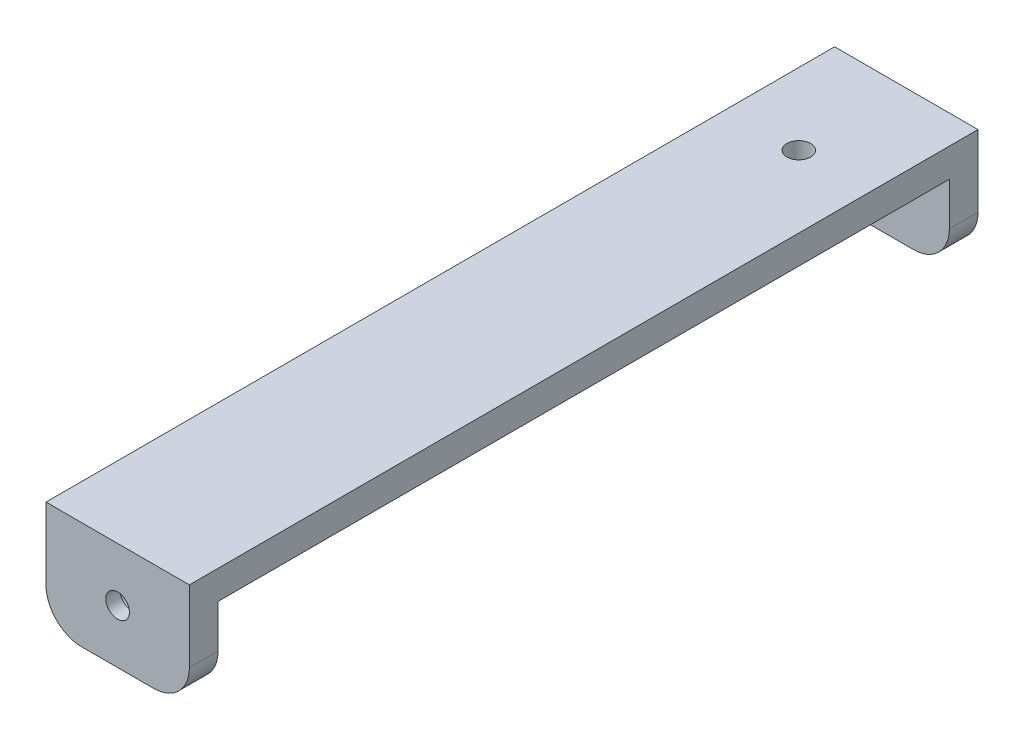
ISO-10303-21;
HEADER;
FILE_DESCRIPTION(('STEP AP214'),'2;1');
FILE_NAME('part.step','',(''),(''),'','','');
FILE_SCHEMA(('AUTOMOTIVE_DESIGN { 1 0 10303 214 1 1 1 1 }'));
ENDSEC;
DATA;
#1=APPLICATION_CONTEXT('core data for automotive mechanical design processes');
#2=APPLICATION_PROTOCOL_DEFINITION('international standard','automotive_design',2000,#1);
#3=PRODUCT_CONTEXT('',#1,'mechanical');
#4=PRODUCT('Part','Part','',(#3));
#5=PRODUCT_RELATED_PRODUCT_CATEGORY('part','',(#4));
#6=PRODUCT_DEFINITION_FORMATION('','',#4);
#7=PRODUCT_DEFINITION_CONTEXT('part definition',#1,'design');
#8=PRODUCT_DEFINITION('design','',#6,#7);
#9=PRODUCT_DEFINITION_SHAPE('','',#8);
#10=(LENGTH_UNIT() NAMED_UNIT(*) SI_UNIT(.MILLI.,.METRE.));
#11=(NAMED_UNIT(*) PLANE_ANGLE_UNIT() SI_UNIT($,.RADIAN.));
#12=(NAMED_UNIT(*) SI_UNIT($,.STERADIAN.) SOLID_ANGLE_UNIT());
#13=UNCERTAINTY_MEASURE_WITH_UNIT(LENGTH_MEASURE(1.E-05),#10,'distance_accuracy_value','');
#14=(GEOMETRIC_REPRESENTATION_CONTEXT(3) GLOBAL_UNCERTAINTY_ASSIGNED_CONTEXT((#13)) GLOBAL_UNIT_ASSIGNED_CONTEXT((#10,
#11,#12)) REPRESENTATION_CONTEXT('',''));
#15=CARTESIAN_POINT('',(0.,0.,0.));
#16=DIRECTION('',(0.,0.,1.));
#17=DIRECTION('',(1.,0.,0.));
#18=AXIS2_PLACEMENT_3D('',#15,#16,#17);
#19=CARTESIAN_POINT('',(-0.512507822280768,122.5,381.));
#20=DIRECTION('',(0.,0.,-1.));
#21=DIRECTION('',(0.,1.,0.));
#22=AXIS2_PLACEMENT_3D('',#19,#20,#21);
#23=CYLINDRICAL_SURFACE('',#22,1.65);
#24=CARTESIAN_POINT('',(-0.512507822280768,122.5,360.));
#25=DIRECTION('',(0.,0.,-1.));
#26=DIRECTION('',(0.,1.,0.));
#27=AXIS2_PLACEMENT_3D('',#24,#25,#26);
#28=CIRCLE('',#27,1.65);
#29=CARTESIAN_POINT('',(-0.512507822280768,124.15,360.));
#30=VERTEX_POINT('',#29);
#31=EDGE_CURVE('E371',#30,#30,#28,.F.);
#32=ORIENTED_EDGE('',*,*,#31,.T.);
#33=EDGE_LOOP('',(#32));
#34=FACE_BOUND('',#33,.T.);
#35=CARTESIAN_POINT('',(-0.512507822280768,122.5,358.));
#36=DIRECTION('',(0.,0.,1.));
#37=DIRECTION('',(0.,-1.,0.));
#38=AXIS2_PLACEMENT_3D('',#35,#36,#37);
#39=CIRCLE('',#38,1.65);
#40=CARTESIAN_POINT('',(-0.512507822280768,120.85,358.));
#41=VERTEX_POINT('',#40);
#42=EDGE_CURVE('E422',#41,#41,#39,.T.);
#43=ORIENTED_EDGE('',*,*,#42,.F.);
#44=EDGE_LOOP('',(#43));
#45=FACE_BOUND('',#44,.T.);
#46=ADVANCED_FACE('F16',(#34,#45),#23,.F.);
#47=CARTESIAN_POINT('',(-0.512507822280768,122.5,249.998));
#48=DIRECTION('',(0.,0.,1.));
#49=DIRECTION('',(0.,-1.,0.));
#50=AXIS2_PLACEMENT_3D('',#47,#48,#49);
#51=CYLINDRICAL_SURFACE('',#50,1.65);
#52=CARTESIAN_POINT('',(-0.512507822280768,122.5,250.));
#53=DIRECTION('',(0.,0.,1.));
#54=DIRECTION('',(0.,-1.,0.));
#55=AXIS2_PLACEMENT_3D('',#52,#53,#54);
#56=CIRCLE('',#55,1.65);
#57=CARTESIAN_POINT('',(-0.512507822280768,120.85,250.));
#58=VERTEX_POINT('',#57);
#59=EDGE_CURVE('E265',#58,#58,#56,.F.);
#60=ORIENTED_EDGE('',*,*,#59,.T.);
#61=EDGE_LOOP('',(#60));
#62=FACE_BOUND('',#61,.T.);
#63=CARTESIAN_POINT('',(-0.512507822280768,122.5,252.));
#64=DIRECTION('',(0.,0.,1.));
#65=DIRECTION('',(1.,0.,0.));
#66=AXIS2_PLACEMENT_3D('',#63,#64,#65);
#67=CIRCLE('',#66,1.65);
#68=CARTESIAN_POINT('',(1.13749217771923,122.5,252.));
#69=VERTEX_POINT('',#68);
#70=EDGE_CURVE('E370',#69,#69,#67,.T.);
#71=ORIENTED_EDGE('',*,*,#70,.T.);
#72=EDGE_LOOP('',(#71));
#73=FACE_BOUND('',#72,.T.);
#74=ADVANCED_FACE('F343',(#62,#73),#51,.F.);
#75=CARTESIAN_POINT('',(9.5,126.,357.932813763619));
#76=DIRECTION('',(1.,0.,0.));
#77=DIRECTION('',(0.,0.,-1.));
#78=AXIS2_PLACEMENT_3D('',#75,#76,#77);
#79=PLANE('',#78);
#80=DIRECTION('',(0.,1.,0.));
#81=VECTOR('',#80,1.);
#82=CARTESIAN_POINT('',(9.5,115.,254.));
#83=LINE('',#82,#81);
#84=CARTESIAN_POINT('',(9.5,120.,254.));
#85=VERTEX_POINT('',#84);
#86=CARTESIAN_POINT('',(9.5,126.,254.));
#87=VERTEX_POINT('',#86);
#88=EDGE_CURVE('E149',#85,#87,#83,.T.);
#89=ORIENTED_EDGE('',*,*,#88,.F.);
#90=DIRECTION('',(0.,0.,1.));
#91=VECTOR('',#90,1.);
#92=CARTESIAN_POINT('',(9.5,120.,250.));
#93=LINE('',#92,#91);
#94=CARTESIAN_POINT('',(9.5,120.,250.));
#95=VERTEX_POINT('',#94);
#96=EDGE_CURVE('E239',#85,#95,#93,.F.);
#97=ORIENTED_EDGE('',*,*,#96,.T.);
#98=DIRECTION('',(0.,1.,0.));
#99=VECTOR('',#98,1.);
#100=CARTESIAN_POINT('',(9.5,126.,250.));
#101=LINE('',#100,#99);
#102=CARTESIAN_POINT('',(9.5,130.,250.));
#103=VERTEX_POINT('',#102);
#104=EDGE_CURVE('E206',#95,#103,#101,.T.);
#105=ORIENTED_EDGE('',*,*,#104,.T.);
#106=DIRECTION('',(0.,0.,-1.));
#107=VECTOR('',#106,1.);
#108=CARTESIAN_POINT('',(9.5,130.,357.932813763619));
#109=LINE('',#108,#107);
#110=CARTESIAN_POINT('',(9.50000000000015,130.,360.));
#111=VERTEX_POINT('',#110);
#112=EDGE_CURVE('E193',#111,#103,#109,.T.);
#113=ORIENTED_EDGE('',*,*,#112,.F.);
#114=DIRECTION('',(0.,1.,0.));
#115=VECTOR('',#114,1.);
#116=CARTESIAN_POINT('',(9.50000000000015,126.,360.));
#117=LINE('',#116,#115);
#118=CARTESIAN_POINT('',(9.50000000000015,120.,360.));
#119=VERTEX_POINT('',#118);
#120=EDGE_CURVE('E173',#119,#111,#117,.T.);
#121=ORIENTED_EDGE('',*,*,#120,.F.);
#122=DIRECTION('',(0.,0.,-1.));
#123=VECTOR('',#122,1.);
#124=CARTESIAN_POINT('',(9.5,120.,356.));
#125=LINE('',#124,#123);
#126=CARTESIAN_POINT('',(9.5,120.,356.));
#127=VERTEX_POINT('',#126);
#128=EDGE_CURVE('E235',#119,#127,#125,.T.);
#129=ORIENTED_EDGE('',*,*,#128,.T.);
#130=DIRECTION('',(0.,1.,0.));
#131=VECTOR('',#130,1.);
#132=CARTESIAN_POINT('',(9.5,115.,356.));
#133=LINE('',#132,#131);
#134=CARTESIAN_POINT('',(9.5,126.,356.));
#135=VERTEX_POINT('',#134);
#136=EDGE_CURVE('E186',#127,#135,#133,.T.);
#137=ORIENTED_EDGE('',*,*,#136,.T.);
#138=DIRECTION('',(0.,0.,-1.));
#139=VECTOR('',#138,1.);
#140=CARTESIAN_POINT('',(9.5,126.,357.932813763619));
#141=LINE('',#140,#139);
#142=EDGE_CURVE('E166',#135,#87,#141,.T.);
#143=ORIENTED_EDGE('',*,*,#142,.T.);
#144=EDGE_LOOP('',(#89,#97,#105,#113,#121,#129,#137,#143));
#145=FACE_BOUND('',#144,.T.);
#146=ADVANCED_FACE('F338',(#145),#79,.T.);
#147=CARTESIAN_POINT('',(1.1693695560098,126.,250.));
#148=DIRECTION('',(0.,0.,1.));
#149=DIRECTION('',(0.,-1.,0.));
#150=AXIS2_PLACEMENT_3D('',#147,#148,#149);
#151=PLANE('',#150);
#152=ORIENTED_EDGE('',*,*,#59,.F.);
#153=EDGE_LOOP('',(#152));
#154=FACE_BOUND('',#153,.T.);
#155=DIRECTION('',(1.,0.,0.));
#156=VECTOR('',#155,1.);
#157=CARTESIAN_POINT('',(1.1693695560098,115.,250.));
#158=LINE('',#157,#156);
#159=CARTESIAN_POINT('',(-5.49999999999992,115.,250.));
#160=VERTEX_POINT('',#159);
#161=CARTESIAN_POINT('',(4.50000000000008,115.,250.));
#162=VERTEX_POINT('',#161);
#163=EDGE_CURVE('E260',#160,#162,#158,.T.);
#164=ORIENTED_EDGE('',*,*,#163,.F.);
#165=CARTESIAN_POINT('',(-5.49999999999992,120.,250.));
#166=DIRECTION('',(0.,0.,1.));
#167=DIRECTION('',(0.,-1.,0.));
#168=AXIS2_PLACEMENT_3D('',#165,#166,#167);
#169=CIRCLE('',#168,5.);
#170=CARTESIAN_POINT('',(-10.5,120.,250.));
#171=VERTEX_POINT('',#170);
#172=EDGE_CURVE('E232',#160,#171,#169,.F.);
#173=ORIENTED_EDGE('',*,*,#172,.T.);
#174=DIRECTION('',(0.,1.,0.));
#175=VECTOR('',#174,1.);
#176=CARTESIAN_POINT('',(-10.5,126.,250.));
#177=LINE('',#176,#175);
#178=CARTESIAN_POINT('',(-10.5,130.,250.));
#179=VERTEX_POINT('',#178);
#180=EDGE_CURVE('E205',#171,#179,#177,.T.);
#181=ORIENTED_EDGE('',*,*,#180,.T.);
#182=DIRECTION('',(1.,0.,0.));
#183=VECTOR('',#182,1.);
#184=CARTESIAN_POINT('',(1.1693695560098,130.,250.));
#185=LINE('',#184,#183);
#186=EDGE_CURVE('E181',#179,#103,#185,.T.);
#187=ORIENTED_EDGE('',*,*,#186,.T.);
#188=ORIENTED_EDGE('',*,*,#104,.F.);
#189=CARTESIAN_POINT('',(4.50000000000008,120.,250.));
#190=DIRECTION('',(0.,0.,1.));
#191=DIRECTION('',(0.,-1.,0.));
#192=AXIS2_PLACEMENT_3D('',#189,#190,#191);
#193=CIRCLE('',#192,5.);
#194=EDGE_CURVE('E229',#95,#162,#193,.F.);
#195=ORIENTED_EDGE('',*,*,#194,.T.);
#196=EDGE_LOOP('',(#164,#173,#181,#187,#188,#195));
#197=FACE_BOUND('',#196,.T.);
#198=ADVANCED_FACE('F342',(#154,#197),#151,.F.);
#199=CARTESIAN_POINT('',(-10.5,126.,357.932813763619));
#200=DIRECTION('',(1.,0.,0.));
#201=DIRECTION('',(0.,0.,-1.));
#202=AXIS2_PLACEMENT_3D('',#199,#200,#201);
#203=PLANE('',#202);
#204=ORIENTED_EDGE('',*,*,#180,.F.);
#205=DIRECTION('',(0.,0.,1.));
#206=VECTOR('',#205,1.);
#207=CARTESIAN_POINT('',(-10.5,120.,357.932813763619));
#208=LINE('',#207,#206);
#209=CARTESIAN_POINT('',(-10.5,120.,254.));
#210=VERTEX_POINT('',#209);
#211=EDGE_CURVE('E145',#171,#210,#208,.T.);
#212=ORIENTED_EDGE('',*,*,#211,.T.);
#213=DIRECTION('',(0.,1.,0.));
#214=VECTOR('',#213,1.);
#215=CARTESIAN_POINT('',(-10.5,115.,254.));
#216=LINE('',#215,#214);
#217=CARTESIAN_POINT('',(-10.5,126.,254.));
#218=VERTEX_POINT('',#217);
#219=EDGE_CURVE('E137',#210,#218,#216,.T.);
#220=ORIENTED_EDGE('',*,*,#219,.T.);
#221=DIRECTION('',(0.,0.,-1.));
#222=VECTOR('',#221,1.);
#223=CARTESIAN_POINT('',(-10.5,126.,357.932813763619));
#224=LINE('',#223,#222);
#225=CARTESIAN_POINT('',(-10.5,126.,356.));
#226=VERTEX_POINT('',#225);
#227=EDGE_CURVE('E143',#226,#218,#224,.T.);
#228=ORIENTED_EDGE('',*,*,#227,.F.);
#229=DIRECTION('',(0.,1.,0.));
#230=VECTOR('',#229,1.);
#231=CARTESIAN_POINT('',(-10.5,115.,356.));
#232=LINE('',#231,#230);
#233=CARTESIAN_POINT('',(-10.5,120.,356.));
#234=VERTEX_POINT('',#233);
#235=EDGE_CURVE('E285',#234,#226,#232,.T.);
#236=ORIENTED_EDGE('',*,*,#235,.F.);
#237=DIRECTION('',(0.,0.,-1.));
#238=VECTOR('',#237,1.);
#239=CARTESIAN_POINT('',(-10.5,120.,357.932813763619));
#240=LINE('',#239,#238);
#241=CARTESIAN_POINT('',(-10.4999999999999,120.,360.));
#242=VERTEX_POINT('',#241);
#243=EDGE_CURVE('E158',#234,#242,#240,.F.);
#244=ORIENTED_EDGE('',*,*,#243,.T.);
#245=DIRECTION('',(0.,1.,0.));
#246=VECTOR('',#245,1.);
#247=CARTESIAN_POINT('',(-10.4999999999999,126.,360.));
#248=LINE('',#247,#246);
#249=CARTESIAN_POINT('',(-10.4999999999999,130.,360.));
#250=VERTEX_POINT('',#249);
#251=EDGE_CURVE('E202',#242,#250,#248,.T.);
#252=ORIENTED_EDGE('',*,*,#251,.T.);
#253=DIRECTION('',(0.,0.,-1.));
#254=VECTOR('',#253,1.);
#255=CARTESIAN_POINT('',(-10.5,130.,357.932813763619));
#256=LINE('',#255,#254);
#257=EDGE_CURVE('E190',#250,#179,#256,.T.);
#258=ORIENTED_EDGE('',*,*,#257,.T.);
#259=EDGE_LOOP('',(#204,#212,#220,#228,#236,#244,#252,#258));
#260=FACE_BOUND('',#259,.T.);
#261=ADVANCED_FACE('F140',(#260),#203,.F.);
#262=CARTESIAN_POINT('',(180.,126.,360.));
#263=DIRECTION('',(0.,0.,-1.));
#264=DIRECTION('',(0.,1.,0.));
#265=AXIS2_PLACEMENT_3D('',#262,#263,#264);
#266=PLANE('',#265);
#267=ORIENTED_EDGE('',*,*,#31,.F.);
#268=EDGE_LOOP('',(#267));
#269=FACE_BOUND('',#268,.T.);
#270=DIRECTION('',(-1.,0.,0.));
#271=VECTOR('',#270,1.);
#272=CARTESIAN_POINT('',(180.,115.,360.));
#273=LINE('',#272,#271);
#274=CARTESIAN_POINT('',(4.50000000000014,115.,360.));
#275=VERTEX_POINT('',#274);
#276=CARTESIAN_POINT('',(-5.49999999999987,115.,360.));
#277=VERTEX_POINT('',#276);
#278=EDGE_CURVE('E291',#275,#277,#273,.T.);
#279=ORIENTED_EDGE('',*,*,#278,.F.);
#280=CARTESIAN_POINT('',(4.50000000000009,120.,360.));
#281=DIRECTION('',(0.,0.,-1.));
#282=DIRECTION('',(0.,1.,0.));
#283=AXIS2_PLACEMENT_3D('',#280,#281,#282);
#284=CIRCLE('',#283,5.);
#285=EDGE_CURVE('E10',#275,#119,#284,.F.);
#286=ORIENTED_EDGE('',*,*,#285,.T.);
#287=ORIENTED_EDGE('',*,*,#120,.T.);
#288=DIRECTION('',(-1.,0.,0.));
#289=VECTOR('',#288,1.);
#290=CARTESIAN_POINT('',(180.,130.,360.));
#291=LINE('',#290,#289);
#292=EDGE_CURVE('E177',#111,#250,#291,.T.);
#293=ORIENTED_EDGE('',*,*,#292,.T.);
#294=ORIENTED_EDGE('',*,*,#251,.F.);
#295=CARTESIAN_POINT('',(-5.49999999999991,120.,360.));
#296=DIRECTION('',(0.,0.,-1.));
#297=DIRECTION('',(0.,1.,0.));
#298=AXIS2_PLACEMENT_3D('',#295,#296,#297);
#299=CIRCLE('',#298,5.);
#300=EDGE_CURVE('E25',#242,#277,#299,.F.);
#301=ORIENTED_EDGE('',*,*,#300,.T.);
#302=EDGE_LOOP('',(#279,#286,#287,#293,#294,#301));
#303=FACE_BOUND('',#302,.T.);
#304=ADVANCED_FACE('F352',(#269,#303),#266,.F.);
#305=CARTESIAN_POINT('',(-0.49999999999992,126.,265.));
#306=DIRECTION('',(0.,1.,0.));
#307=DIRECTION('',(0.,0.,1.));
#308=AXIS2_PLACEMENT_3D('',#305,#306,#307);
#309=CYLINDRICAL_SURFACE('',#308,1.65);
#310=CARTESIAN_POINT('',(-0.49999999999992,126.,265.));
#311=DIRECTION('',(0.,1.,0.));
#312=DIRECTION('',(-1.,0.,0.));
#313=AXIS2_PLACEMENT_3D('',#310,#311,#312);
#314=CIRCLE('',#313,1.65);
#315=CARTESIAN_POINT('',(-2.14999999999992,126.,265.));
#316=VERTEX_POINT('',#315);
#317=EDGE_CURVE('E167',#316,#316,#314,.T.);
#318=ORIENTED_EDGE('',*,*,#317,.F.);
#319=EDGE_LOOP('',(#318));
#320=FACE_BOUND('',#319,.T.);
#321=CARTESIAN_POINT('',(-0.49999999999992,130.,265.));
#322=DIRECTION('',(0.,1.,0.));
#323=DIRECTION('',(-1.,0.,0.));
#324=AXIS2_PLACEMENT_3D('',#321,#322,#323);
#325=CIRCLE('',#324,1.65);
#326=CARTESIAN_POINT('',(-2.14999999999992,130.,265.));
#327=VERTEX_POINT('',#326);
#328=EDGE_CURVE('E185',#327,#327,#325,.T.);
#329=ORIENTED_EDGE('',*,*,#328,.T.);
#330=EDGE_LOOP('',(#329));
#331=FACE_BOUND('',#330,.T.);
#332=ADVANCED_FACE('F408',(#320,#331),#309,.F.);
#333=CARTESIAN_POINT('',(0.,126.,312.5));
#334=DIRECTION('',(0.,1.,0.));
#335=DIRECTION('',(-1.,0.,0.));
#336=AXIS2_PLACEMENT_3D('',#333,#334,#335);
#337=PLANE('',#336);
#338=ORIENTED_EDGE('',*,*,#227,.T.);
#339=DIRECTION('',(1.,0.,0.));
#340=VECTOR('',#339,1.);
#341=CARTESIAN_POINT('',(0.,126.,254.));
#342=LINE('',#341,#340);
#343=EDGE_CURVE('E152',#218,#87,#342,.T.);
#344=ORIENTED_EDGE('',*,*,#343,.T.);
#345=ORIENTED_EDGE('',*,*,#142,.F.);
#346=DIRECTION('',(-1.,0.,0.));
#347=VECTOR('',#346,1.);
#348=CARTESIAN_POINT('',(0.,126.,356.));
#349=LINE('',#348,#347);
#350=EDGE_CURVE('E159',#135,#226,#349,.T.);
#351=ORIENTED_EDGE('',*,*,#350,.T.);
#352=EDGE_LOOP('',(#338,#344,#345,#351));
#353=FACE_BOUND('',#352,.T.);
#354=ORIENTED_EDGE('',*,*,#317,.T.);
#355=EDGE_LOOP('',(#354));
#356=FACE_BOUND('',#355,.T.);
#357=ADVANCED_FACE('F162',(#353,#356),#337,.F.);
#358=CARTESIAN_POINT('',(0.,130.,312.5));
#359=DIRECTION('',(0.,1.,0.));
#360=DIRECTION('',(-1.,0.,0.));
#361=AXIS2_PLACEMENT_3D('',#358,#359,#360);
#362=PLANE('',#361);
#363=ORIENTED_EDGE('',*,*,#112,.T.);
#364=ORIENTED_EDGE('',*,*,#186,.F.);
#365=ORIENTED_EDGE('',*,*,#257,.F.);
#366=ORIENTED_EDGE('',*,*,#292,.F.);
#367=EDGE_LOOP('',(#363,#364,#365,#366));
#368=FACE_BOUND('',#367,.T.);
#369=ORIENTED_EDGE('',*,*,#328,.F.);
#370=EDGE_LOOP('',(#369));
#371=FACE_BOUND('',#370,.T.);
#372=ADVANCED_FACE('F450',(#368,#371),#362,.T.);
#373=CARTESIAN_POINT('',(-1.8569283857941,115.,356.));
#374=DIRECTION('',(0.,0.,-1.));
#375=DIRECTION('',(0.,1.,0.));
#376=AXIS2_PLACEMENT_3D('',#373,#374,#375);
#377=PLANE('',#376);
#378=CARTESIAN_POINT('',(-0.512507822280768,122.5,356.));
#379=DIRECTION('',(0.,0.,1.));
#380=DIRECTION('',(0.,-1.,0.));
#381=AXIS2_PLACEMENT_3D('',#378,#379,#380);
#382=CIRCLE('',#381,3.);
#383=CARTESIAN_POINT('',(-0.512507822280768,119.5,356.));
#384=VERTEX_POINT('',#383);
#385=EDGE_CURVE('E418',#384,#384,#382,.T.);
#386=ORIENTED_EDGE('',*,*,#385,.T.);
#387=EDGE_LOOP('',(#386));
#388=FACE_BOUND('',#387,.T.);
#389=ORIENTED_EDGE('',*,*,#136,.F.);
#390=CARTESIAN_POINT('',(4.50000000000009,120.,356.));
#391=DIRECTION('',(0.,0.,-1.));
#392=DIRECTION('',(0.,1.,0.));
#393=AXIS2_PLACEMENT_3D('',#390,#391,#392);
#394=CIRCLE('',#393,5.);
#395=CARTESIAN_POINT('',(4.50000000000009,115.,356.));
#396=VERTEX_POINT('',#395);
#397=EDGE_CURVE('E245',#127,#396,#394,.T.);
#398=ORIENTED_EDGE('',*,*,#397,.T.);
#399=DIRECTION('',(-1.,0.,0.));
#400=VECTOR('',#399,1.);
#401=CARTESIAN_POINT('',(-1.8569283857941,115.,356.));
#402=LINE('',#401,#400);
#403=CARTESIAN_POINT('',(-5.49999999999991,115.,356.));
#404=VERTEX_POINT('',#403);
#405=EDGE_CURVE('E148',#396,#404,#402,.T.);
#406=ORIENTED_EDGE('',*,*,#405,.T.);
#407=CARTESIAN_POINT('',(-5.49999999999991,120.,356.));
#408=DIRECTION('',(0.,0.,-1.));
#409=DIRECTION('',(0.,1.,0.));
#410=AXIS2_PLACEMENT_3D('',#407,#408,#409);
#411=CIRCLE('',#410,5.);
#412=EDGE_CURVE('E242',#404,#234,#411,.T.);
#413=ORIENTED_EDGE('',*,*,#412,.T.);
#414=ORIENTED_EDGE('',*,*,#235,.T.);
#415=ORIENTED_EDGE('',*,*,#350,.F.);
#416=EDGE_LOOP('',(#389,#398,#406,#413,#414,#415));
#417=FACE_BOUND('',#416,.T.);
#418=ADVANCED_FACE('F328',(#388,#417),#377,.T.);
#419=CARTESIAN_POINT('',(0.,115.,312.5));
#420=DIRECTION('',(0.,1.,0.));
#421=DIRECTION('',(-1.,0.,0.));
#422=AXIS2_PLACEMENT_3D('',#419,#420,#421);
#423=PLANE('',#422);
#424=ORIENTED_EDGE('',*,*,#405,.F.);
#425=DIRECTION('',(0.,0.,-1.));
#426=VECTOR('',#425,1.);
#427=CARTESIAN_POINT('',(4.50000000000009,115.,360.));
#428=LINE('',#427,#426);
#429=EDGE_CURVE('E47',#396,#275,#428,.F.);
#430=ORIENTED_EDGE('',*,*,#429,.T.);
#431=ORIENTED_EDGE('',*,*,#278,.T.);
#432=DIRECTION('',(0.,0.,-1.));
#433=VECTOR('',#432,1.);
#434=CARTESIAN_POINT('',(-5.49999999999992,115.,312.5));
#435=LINE('',#434,#433);
#436=EDGE_CURVE('E248',#277,#404,#435,.T.);
#437=ORIENTED_EDGE('',*,*,#436,.T.);
#438=EDGE_LOOP('',(#424,#430,#431,#437));
#439=FACE_BOUND('',#438,.T.);
#440=ADVANCED_FACE('F324',(#439),#423,.F.);
#441=CARTESIAN_POINT('',(-1.85692838579411,115.,254.));
#442=DIRECTION('',(0.,0.,1.));
#443=DIRECTION('',(1.,0.,0.));
#444=AXIS2_PLACEMENT_3D('',#441,#442,#443);
#445=PLANE('',#444);
#446=CARTESIAN_POINT('',(-0.512507822280768,122.5,254.));
#447=DIRECTION('',(0.,0.,1.));
#448=DIRECTION('',(1.,0.,0.));
#449=AXIS2_PLACEMENT_3D('',#446,#447,#448);
#450=CIRCLE('',#449,3.);
#451=CARTESIAN_POINT('',(2.48749217771923,122.5,254.));
#452=VERTEX_POINT('',#451);
#453=EDGE_CURVE('E366',#452,#452,#450,.T.);
#454=ORIENTED_EDGE('',*,*,#453,.F.);
#455=EDGE_LOOP('',(#454));
#456=FACE_BOUND('',#455,.T.);
#457=ORIENTED_EDGE('',*,*,#219,.F.);
#458=CARTESIAN_POINT('',(-5.49999999999992,120.,254.));
#459=DIRECTION('',(0.,0.,1.));
#460=DIRECTION('',(1.,0.,0.));
#461=AXIS2_PLACEMENT_3D('',#458,#459,#460);
#462=CIRCLE('',#461,5.);
#463=CARTESIAN_POINT('',(-5.49999999999992,115.,254.));
#464=VERTEX_POINT('',#463);
#465=EDGE_CURVE('E219',#210,#464,#462,.T.);
#466=ORIENTED_EDGE('',*,*,#465,.T.);
#467=DIRECTION('',(1.,0.,0.));
#468=VECTOR('',#467,1.);
#469=CARTESIAN_POINT('',(-1.85692838579411,115.,254.));
#470=LINE('',#469,#468);
#471=CARTESIAN_POINT('',(4.50000000000008,115.,254.));
#472=VERTEX_POINT('',#471);
#473=EDGE_CURVE('E264',#464,#472,#470,.T.);
#474=ORIENTED_EDGE('',*,*,#473,.T.);
#475=CARTESIAN_POINT('',(4.50000000000008,120.,254.));
#476=DIRECTION('',(0.,0.,1.));
#477=DIRECTION('',(1.,0.,0.));
#478=AXIS2_PLACEMENT_3D('',#475,#476,#477);
#479=CIRCLE('',#478,5.);
#480=EDGE_CURVE('E216',#472,#85,#479,.T.);
#481=ORIENTED_EDGE('',*,*,#480,.T.);
#482=ORIENTED_EDGE('',*,*,#88,.T.);
#483=ORIENTED_EDGE('',*,*,#343,.F.);
#484=EDGE_LOOP('',(#457,#466,#474,#481,#482,#483));
#485=FACE_BOUND('',#484,.T.);
#486=ADVANCED_FACE('F153',(#456,#485),#445,.T.);
#487=CARTESIAN_POINT('',(0.,115.,312.5));
#488=DIRECTION('',(0.,1.,0.));
#489=DIRECTION('',(-1.,0.,0.));
#490=AXIS2_PLACEMENT_3D('',#487,#488,#489);
#491=PLANE('',#490);
#492=ORIENTED_EDGE('',*,*,#473,.F.);
#493=DIRECTION('',(0.,0.,1.));
#494=VECTOR('',#493,1.);
#495=CARTESIAN_POINT('',(-5.49999999999992,115.,312.5));
#496=LINE('',#495,#494);
#497=EDGE_CURVE('E226',#464,#160,#496,.F.);
#498=ORIENTED_EDGE('',*,*,#497,.T.);
#499=ORIENTED_EDGE('',*,*,#163,.T.);
#500=DIRECTION('',(0.,0.,1.));
#501=VECTOR('',#500,1.);
#502=CARTESIAN_POINT('',(4.50000000000008,115.,254.));
#503=LINE('',#502,#501);
#504=EDGE_CURVE('E222',#162,#472,#503,.T.);
#505=ORIENTED_EDGE('',*,*,#504,.T.);
#506=EDGE_LOOP('',(#492,#498,#499,#505));
#507=FACE_BOUND('',#506,.T.);
#508=ADVANCED_FACE('F314',(#507),#491,.F.);
#509=CARTESIAN_POINT('',(-5.49999999999991,120.,357.932813763619));
#510=DIRECTION('',(0.,0.,1.));
#511=DIRECTION('',(0.,-1.,0.));
#512=AXIS2_PLACEMENT_3D('',#509,#510,#511);
#513=CYLINDRICAL_SURFACE('',#512,5.);
#514=ORIENTED_EDGE('',*,*,#172,.F.);
#515=ORIENTED_EDGE('',*,*,#497,.F.);
#516=ORIENTED_EDGE('',*,*,#465,.F.);
#517=ORIENTED_EDGE('',*,*,#211,.F.);
#518=EDGE_LOOP('',(#514,#515,#516,#517));
#519=FACE_BOUND('',#518,.T.);
#520=ADVANCED_FACE('F310',(#519),#513,.T.);
#521=CARTESIAN_POINT('',(4.50000000000009,120.,312.5));
#522=DIRECTION('',(0.,0.,-1.));
#523=DIRECTION('',(0.,1.,0.));
#524=AXIS2_PLACEMENT_3D('',#521,#522,#523);
#525=CYLINDRICAL_SURFACE('',#524,5.);
#526=ORIENTED_EDGE('',*,*,#194,.F.);
#527=ORIENTED_EDGE('',*,*,#96,.F.);
#528=ORIENTED_EDGE('',*,*,#480,.F.);
#529=ORIENTED_EDGE('',*,*,#504,.F.);
#530=EDGE_LOOP('',(#526,#527,#528,#529));
#531=FACE_BOUND('',#530,.T.);
#532=ADVANCED_FACE('F298',(#531),#525,.T.);
#533=CARTESIAN_POINT('',(4.50000000000009,120.,357.932813763619));
#534=DIRECTION('',(0.,0.,1.));
#535=DIRECTION('',(0.,-1.,0.));
#536=AXIS2_PLACEMENT_3D('',#533,#534,#535);
#537=CYLINDRICAL_SURFACE('',#536,5.);
#538=ORIENTED_EDGE('',*,*,#285,.F.);
#539=ORIENTED_EDGE('',*,*,#429,.F.);
#540=ORIENTED_EDGE('',*,*,#397,.F.);
#541=ORIENTED_EDGE('',*,*,#128,.F.);
#542=EDGE_LOOP('',(#538,#539,#540,#541));
#543=FACE_BOUND('',#542,.T.);
#544=ADVANCED_FACE('F294',(#543),#537,.T.);
#545=CARTESIAN_POINT('',(-5.49999999999992,120.,312.5));
#546=DIRECTION('',(0.,0.,-1.));
#547=DIRECTION('',(0.,1.,0.));
#548=AXIS2_PLACEMENT_3D('',#545,#546,#547);
#549=CYLINDRICAL_SURFACE('',#548,5.);
#550=ORIENTED_EDGE('',*,*,#300,.F.);
#551=ORIENTED_EDGE('',*,*,#243,.F.);
#552=ORIENTED_EDGE('',*,*,#412,.F.);
#553=ORIENTED_EDGE('',*,*,#436,.F.);
#554=EDGE_LOOP('',(#550,#551,#552,#553));
#555=FACE_BOUND('',#554,.T.);
#556=ADVANCED_FACE('F18',(#555),#549,.T.);
#557=CARTESIAN_POINT('',(-0.512507822280768,122.5,252.));
#558=DIRECTION('',(0.,0.,1.));
#559=DIRECTION('',(0.,-1.,0.));
#560=AXIS2_PLACEMENT_3D('',#557,#558,#559);
#561=CYLINDRICAL_SURFACE('',#560,3.);
#562=CARTESIAN_POINT('',(-0.512507822280768,122.5,252.));
#563=DIRECTION('',(0.,0.,1.));
#564=DIRECTION('',(1.,0.,0.));
#565=AXIS2_PLACEMENT_3D('',#562,#563,#564);
#566=CIRCLE('',#565,3.);
#567=CARTESIAN_POINT('',(2.48749217771923,122.5,252.));
#568=VERTEX_POINT('',#567);
#569=EDGE_CURVE('E359',#568,#568,#566,.T.);
#570=ORIENTED_EDGE('',*,*,#569,.F.);
#571=EDGE_LOOP('',(#570));
#572=FACE_BOUND('',#571,.T.);
#573=ORIENTED_EDGE('',*,*,#453,.T.);
#574=EDGE_LOOP('',(#573));
#575=FACE_BOUND('',#574,.T.);
#576=ADVANCED_FACE('F306',(#572,#575),#561,.F.);
#577=CARTESIAN_POINT('',(-64.0062539111404,120.5,252.));
#578=DIRECTION('',(0.,0.,1.));
#579=DIRECTION('',(1.,0.,0.));
#580=AXIS2_PLACEMENT_3D('',#577,#578,#579);
#581=PLANE('',#580);
#582=ORIENTED_EDGE('',*,*,#70,.F.);
#583=EDGE_LOOP('',(#582));
#584=FACE_BOUND('',#583,.T.);
#585=ORIENTED_EDGE('',*,*,#569,.T.);
#586=EDGE_LOOP('',(#585));
#587=FACE_BOUND('',#586,.T.);
#588=ADVANCED_FACE('F383',(#584,#587),#581,.T.);
#589=CARTESIAN_POINT('',(-0.512507822280768,122.5,358.));
#590=DIRECTION('',(0.,0.,-1.));
#591=DIRECTION('',(0.,1.,0.));
#592=AXIS2_PLACEMENT_3D('',#589,#590,#591);
#593=CYLINDRICAL_SURFACE('',#592,3.);
#594=CARTESIAN_POINT('',(-0.512507822280768,122.5,358.));
#595=DIRECTION('',(0.,0.,1.));
#596=DIRECTION('',(0.,-1.,0.));
#597=AXIS2_PLACEMENT_3D('',#594,#595,#596);
#598=CIRCLE('',#597,3.);
#599=CARTESIAN_POINT('',(-0.512507822280768,119.5,358.));
#600=VERTEX_POINT('',#599);
#601=EDGE_CURVE('E416',#600,#600,#598,.T.);
#602=ORIENTED_EDGE('',*,*,#601,.T.);
#603=EDGE_LOOP('',(#602));
#604=FACE_BOUND('',#603,.T.);
#605=ORIENTED_EDGE('',*,*,#385,.F.);
#606=EDGE_LOOP('',(#605));
#607=FACE_BOUND('',#606,.T.);
#608=ADVANCED_FACE('F390',(#604,#607),#593,.F.);
#609=CARTESIAN_POINT('',(-60.5062539111403,122.5,358.));
#610=DIRECTION('',(0.,0.,-1.));
#611=DIRECTION('',(1.,0.,0.));
#612=AXIS2_PLACEMENT_3D('',#609,#610,#611);
#613=PLANE('',#612);
#614=ORIENTED_EDGE('',*,*,#42,.T.);
#615=EDGE_LOOP('',(#614));
#616=FACE_BOUND('',#615,.T.);
#617=ORIENTED_EDGE('',*,*,#601,.F.);
#618=EDGE_LOOP('',(#617));
#619=FACE_BOUND('',#618,.T.);
#620=ADVANCED_FACE('F434',(#616,#619),#613,.T.);
#621=CLOSED_SHELL('',(#46,#74,#146,#198,#261,#304,#332,#357,#372,#418,#440,#486,#508,#520,#532,
#544,#556,#576,#588,#608,#620));
#622=MANIFOLD_SOLID_BREP('B1',#621);
#623=ADVANCED_BREP_SHAPE_REPRESENTATION('',(#18,#622),#14);
#624=SHAPE_DEFINITION_REPRESENTATION(#9,#623);
ENDSEC;
END-ISO-10303-21;
